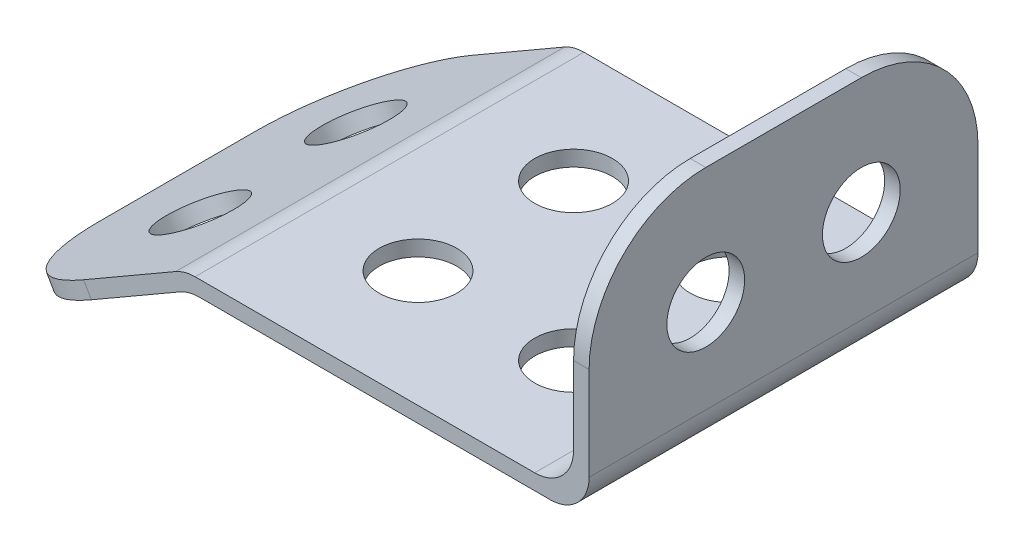
ISO-10303-21;
HEADER;
FILE_DESCRIPTION(('STEP AP214'),'2;1');
FILE_NAME('part.step','',(''),(''),'','','');
FILE_SCHEMA(('AUTOMOTIVE_DESIGN { 1 0 10303 214 1 1 1 1 }'));
ENDSEC;
DATA;
#1=APPLICATION_CONTEXT('core data for automotive mechanical design processes');
#2=APPLICATION_PROTOCOL_DEFINITION('international standard','automotive_design',2000,#1);
#3=PRODUCT_CONTEXT('',#1,'mechanical');
#4=PRODUCT('Part','Part','',(#3));
#5=PRODUCT_RELATED_PRODUCT_CATEGORY('part','',(#4));
#6=PRODUCT_DEFINITION_FORMATION('','',#4);
#7=PRODUCT_DEFINITION_CONTEXT('part definition',#1,'design');
#8=PRODUCT_DEFINITION('design','',#6,#7);
#9=PRODUCT_DEFINITION_SHAPE('','',#8);
#10=(LENGTH_UNIT() NAMED_UNIT(*) SI_UNIT(.MILLI.,.METRE.));
#11=(NAMED_UNIT(*) PLANE_ANGLE_UNIT() SI_UNIT($,.RADIAN.));
#12=(NAMED_UNIT(*) SI_UNIT($,.STERADIAN.) SOLID_ANGLE_UNIT());
#13=UNCERTAINTY_MEASURE_WITH_UNIT(LENGTH_MEASURE(1.E-05),#10,'distance_accuracy_value','');
#14=(GEOMETRIC_REPRESENTATION_CONTEXT(3) GLOBAL_UNCERTAINTY_ASSIGNED_CONTEXT((#13)) GLOBAL_UNIT_ASSIGNED_CONTEXT((#10,
#11,#12)) REPRESENTATION_CONTEXT('',''));
#15=CARTESIAN_POINT('',(0.,0.,0.));
#16=DIRECTION('',(0.,0.,1.));
#17=DIRECTION('',(1.,0.,0.));
#18=AXIS2_PLACEMENT_3D('',#15,#16,#17);
#19=CARTESIAN_POINT('',(10.,-16.7330508075689,35.));
#20=DIRECTION('',(0.,1.,0.));
#21=DIRECTION('',(-1.,0.,0.));
#22=AXIS2_PLACEMENT_3D('',#19,#20,#21);
#23=CYLINDRICAL_SURFACE('',#22,5.);
#24=CARTESIAN_POINT('',(9.99999999999999,0.,35.));
#25=DIRECTION('',(0.,1.,0.));
#26=DIRECTION('',(-1.,0.,0.));
#27=AXIS2_PLACEMENT_3D('',#24,#25,#26);
#28=CIRCLE('',#27,5.);
#29=CARTESIAN_POINT('',(4.99999999999999,0.,35.));
#30=VERTEX_POINT('',#29);
#31=EDGE_CURVE('E244',#30,#30,#28,.T.);
#32=ORIENTED_EDGE('',*,*,#31,.T.);
#33=EDGE_LOOP('',(#32));
#34=FACE_BOUND('',#33,.T.);
#35=CARTESIAN_POINT('',(9.99999999999999,-2.,35.));
#36=DIRECTION('',(0.,1.,0.));
#37=DIRECTION('',(-1.,0.,0.));
#38=AXIS2_PLACEMENT_3D('',#35,#36,#37);
#39=CIRCLE('',#38,5.);
#40=CARTESIAN_POINT('',(4.99999999999999,-2.,35.));
#41=VERTEX_POINT('',#40);
#42=EDGE_CURVE('E248',#41,#41,#39,.F.);
#43=ORIENTED_EDGE('',*,*,#42,.T.);
#44=EDGE_LOOP('',(#43));
#45=FACE_BOUND('',#44,.T.);
#46=ADVANCED_FACE('F41',(#34,#45),#23,.F.);
#47=CARTESIAN_POINT('',(10.,-16.7330508075689,15.));
#48=DIRECTION('',(0.,1.,0.));
#49=DIRECTION('',(-1.,0.,0.));
#50=AXIS2_PLACEMENT_3D('',#47,#48,#49);
#51=CYLINDRICAL_SURFACE('',#50,5.);
#52=CARTESIAN_POINT('',(9.99999999999999,0.,15.));
#53=DIRECTION('',(0.,1.,0.));
#54=DIRECTION('',(-1.,0.,0.));
#55=AXIS2_PLACEMENT_3D('',#52,#53,#54);
#56=CIRCLE('',#55,5.);
#57=CARTESIAN_POINT('',(4.99999999999999,0.,15.));
#58=VERTEX_POINT('',#57);
#59=EDGE_CURVE('E236',#58,#58,#56,.T.);
#60=ORIENTED_EDGE('',*,*,#59,.T.);
#61=EDGE_LOOP('',(#60));
#62=FACE_BOUND('',#61,.T.);
#63=CARTESIAN_POINT('',(9.99999999999999,-2.,15.));
#64=DIRECTION('',(0.,1.,0.));
#65=DIRECTION('',(-1.,0.,0.));
#66=AXIS2_PLACEMENT_3D('',#63,#64,#65);
#67=CIRCLE('',#66,5.);
#68=CARTESIAN_POINT('',(4.99999999999999,-2.,15.));
#69=VERTEX_POINT('',#68);
#70=EDGE_CURVE('E240',#69,#69,#67,.F.);
#71=ORIENTED_EDGE('',*,*,#70,.T.);
#72=EDGE_LOOP('',(#71));
#73=FACE_BOUND('',#72,.T.);
#74=ADVANCED_FACE('F442',(#62,#73),#51,.F.);
#75=CARTESIAN_POINT('',(27.,0.,50.));
#76=DIRECTION('',(-1.,0.,0.));
#77=DIRECTION('',(0.,0.,1.));
#78=AXIS2_PLACEMENT_3D('',#75,#76,#77);
#79=PLANE('',#78);
#80=CARTESIAN_POINT('',(27.,15.,35.));
#81=DIRECTION('',(-1.,0.,0.));
#82=DIRECTION('',(0.,0.,1.));
#83=AXIS2_PLACEMENT_3D('',#80,#81,#82);
#84=CIRCLE('',#83,5.);
#85=CARTESIAN_POINT('',(27.,15.,40.));
#86=VERTEX_POINT('',#85);
#87=EDGE_CURVE('E403',#86,#86,#84,.T.);
#88=ORIENTED_EDGE('',*,*,#87,.T.);
#89=EDGE_LOOP('',(#88));
#90=FACE_BOUND('',#89,.T.);
#91=CARTESIAN_POINT('',(27.,15.,15.));
#92=DIRECTION('',(-1.,0.,0.));
#93=DIRECTION('',(0.,0.,1.));
#94=AXIS2_PLACEMENT_3D('',#91,#92,#93);
#95=CIRCLE('',#94,5.);
#96=CARTESIAN_POINT('',(27.,15.,20.));
#97=VERTEX_POINT('',#96);
#98=EDGE_CURVE('E392',#97,#97,#95,.T.);
#99=ORIENTED_EDGE('',*,*,#98,.T.);
#100=EDGE_LOOP('',(#99));
#101=FACE_BOUND('',#100,.T.);
#102=DIRECTION('',(0.,1.,0.));
#103=VECTOR('',#102,1.);
#104=CARTESIAN_POINT('',(27.,0.,50.));
#105=LINE('',#104,#103);
#106=CARTESIAN_POINT('',(27.,3.00000000000001,50.));
#107=VERTEX_POINT('',#106);
#108=CARTESIAN_POINT('',(27.,15.,50.));
#109=VERTEX_POINT('',#108);
#110=EDGE_CURVE('E323',#107,#109,#105,.T.);
#111=ORIENTED_EDGE('',*,*,#110,.F.);
#112=DIRECTION('',(0.,0.,-1.));
#113=VECTOR('',#112,1.);
#114=CARTESIAN_POINT('',(27.,3.00000000000001,50.));
#115=LINE('',#114,#113);
#116=CARTESIAN_POINT('',(27.,3.00000000000001,0.));
#117=VERTEX_POINT('',#116);
#118=EDGE_CURVE('E166',#107,#117,#115,.T.);
#119=ORIENTED_EDGE('',*,*,#118,.T.);
#120=DIRECTION('',(0.,1.,0.));
#121=VECTOR('',#120,1.);
#122=CARTESIAN_POINT('',(27.,0.,0.));
#123=LINE('',#122,#121);
#124=CARTESIAN_POINT('',(27.,15.,0.));
#125=VERTEX_POINT('',#124);
#126=EDGE_CURVE('E158',#117,#125,#123,.T.);
#127=ORIENTED_EDGE('',*,*,#126,.T.);
#128=CARTESIAN_POINT('',(27.,15.,15.));
#129=DIRECTION('',(-1.,0.,0.));
#130=DIRECTION('',(0.,0.,1.));
#131=AXIS2_PLACEMENT_3D('',#128,#129,#130);
#132=CIRCLE('',#131,15.);
#133=CARTESIAN_POINT('',(27.,30.,15.));
#134=VERTEX_POINT('',#133);
#135=EDGE_CURVE('E163',#125,#134,#132,.F.);
#136=ORIENTED_EDGE('',*,*,#135,.T.);
#137=DIRECTION('',(0.,0.,-1.));
#138=VECTOR('',#137,1.);
#139=CARTESIAN_POINT('',(27.,30.,50.));
#140=LINE('',#139,#138);
#141=CARTESIAN_POINT('',(27.,30.,35.));
#142=VERTEX_POINT('',#141);
#143=EDGE_CURVE('E195',#142,#134,#140,.T.);
#144=ORIENTED_EDGE('',*,*,#143,.F.);
#145=CARTESIAN_POINT('',(27.,15.,35.));
#146=DIRECTION('',(-1.,0.,0.));
#147=DIRECTION('',(0.,0.,1.));
#148=AXIS2_PLACEMENT_3D('',#145,#146,#147);
#149=CIRCLE('',#148,15.);
#150=EDGE_CURVE('E182',#142,#109,#149,.F.);
#151=ORIENTED_EDGE('',*,*,#150,.T.);
#152=EDGE_LOOP('',(#111,#119,#127,#136,#144,#151));
#153=FACE_BOUND('',#152,.T.);
#154=ADVANCED_FACE('F161',(#90,#101,#153),#79,.F.);
#155=CARTESIAN_POINT('',(25.,30.,50.));
#156=DIRECTION('',(0.,1.,0.));
#157=DIRECTION('',(0.,0.,1.));
#158=AXIS2_PLACEMENT_3D('',#155,#156,#157);
#159=PLANE('',#158);
#160=ORIENTED_EDGE('',*,*,#143,.T.);
#161=DIRECTION('',(1.,0.,0.));
#162=VECTOR('',#161,1.);
#163=CARTESIAN_POINT('',(25.,30.,15.));
#164=LINE('',#163,#162);
#165=CARTESIAN_POINT('',(25.,30.,15.));
#166=VERTEX_POINT('',#165);
#167=EDGE_CURVE('E179',#134,#166,#164,.F.);
#168=ORIENTED_EDGE('',*,*,#167,.T.);
#169=DIRECTION('',(0.,0.,-1.));
#170=VECTOR('',#169,1.);
#171=CARTESIAN_POINT('',(25.,30.,50.));
#172=LINE('',#171,#170);
#173=CARTESIAN_POINT('',(25.,30.,35.));
#174=VERTEX_POINT('',#173);
#175=EDGE_CURVE('E353',#174,#166,#172,.T.);
#176=ORIENTED_EDGE('',*,*,#175,.F.);
#177=DIRECTION('',(1.,0.,0.));
#178=VECTOR('',#177,1.);
#179=CARTESIAN_POINT('',(27.,30.,35.));
#180=LINE('',#179,#178);
#181=EDGE_CURVE('E181',#174,#142,#180,.T.);
#182=ORIENTED_EDGE('',*,*,#181,.T.);
#183=EDGE_LOOP('',(#160,#168,#176,#182));
#184=FACE_BOUND('',#183,.T.);
#185=ADVANCED_FACE('F357',(#184),#159,.T.);
#186=CARTESIAN_POINT('',(25.,0.,50.));
#187=DIRECTION('',(-1.,0.,0.));
#188=DIRECTION('',(0.,0.,1.));
#189=AXIS2_PLACEMENT_3D('',#186,#187,#188);
#190=PLANE('',#189);
#191=CARTESIAN_POINT('',(25.,15.,35.));
#192=DIRECTION('',(-1.,0.,0.));
#193=DIRECTION('',(0.,0.,1.));
#194=AXIS2_PLACEMENT_3D('',#191,#192,#193);
#195=CIRCLE('',#194,5.);
#196=CARTESIAN_POINT('',(25.,15.,40.));
#197=VERTEX_POINT('',#196);
#198=EDGE_CURVE('E407',#197,#197,#195,.T.);
#199=ORIENTED_EDGE('',*,*,#198,.F.);
#200=EDGE_LOOP('',(#199));
#201=FACE_BOUND('',#200,.T.);
#202=CARTESIAN_POINT('',(25.,15.,15.));
#203=DIRECTION('',(-1.,0.,0.));
#204=DIRECTION('',(0.,0.,1.));
#205=AXIS2_PLACEMENT_3D('',#202,#203,#204);
#206=CIRCLE('',#205,5.);
#207=CARTESIAN_POINT('',(25.,15.,20.));
#208=VERTEX_POINT('',#207);
#209=EDGE_CURVE('E399',#208,#208,#206,.T.);
#210=ORIENTED_EDGE('',*,*,#209,.F.);
#211=EDGE_LOOP('',(#210));
#212=FACE_BOUND('',#211,.T.);
#213=DIRECTION('',(0.,1.,0.));
#214=VECTOR('',#213,1.);
#215=CARTESIAN_POINT('',(25.,0.,0.));
#216=LINE('',#215,#214);
#217=CARTESIAN_POINT('',(25.,5.00000000000001,0.));
#218=VERTEX_POINT('',#217);
#219=CARTESIAN_POINT('',(25.,15.,0.));
#220=VERTEX_POINT('',#219);
#221=EDGE_CURVE('E170',#218,#220,#216,.T.);
#222=ORIENTED_EDGE('',*,*,#221,.F.);
#223=DIRECTION('',(0.,0.,-1.));
#224=VECTOR('',#223,1.);
#225=CARTESIAN_POINT('',(25.,5.00000000000001,50.));
#226=LINE('',#225,#224);
#227=CARTESIAN_POINT('',(25.,5.00000000000001,50.));
#228=VERTEX_POINT('',#227);
#229=EDGE_CURVE('E285',#218,#228,#226,.F.);
#230=ORIENTED_EDGE('',*,*,#229,.T.);
#231=DIRECTION('',(0.,1.,0.));
#232=VECTOR('',#231,1.);
#233=CARTESIAN_POINT('',(25.,0.,50.));
#234=LINE('',#233,#232);
#235=CARTESIAN_POINT('',(25.,15.,50.));
#236=VERTEX_POINT('',#235);
#237=EDGE_CURVE('E311',#228,#236,#234,.T.);
#238=ORIENTED_EDGE('',*,*,#237,.T.);
#239=CARTESIAN_POINT('',(25.,15.,35.));
#240=DIRECTION('',(-1.,0.,0.));
#241=DIRECTION('',(0.,0.,1.));
#242=AXIS2_PLACEMENT_3D('',#239,#240,#241);
#243=CIRCLE('',#242,15.);
#244=EDGE_CURVE('E204',#236,#174,#243,.T.);
#245=ORIENTED_EDGE('',*,*,#244,.T.);
#246=ORIENTED_EDGE('',*,*,#175,.T.);
#247=CARTESIAN_POINT('',(25.,15.,15.));
#248=DIRECTION('',(-1.,0.,0.));
#249=DIRECTION('',(0.,0.,1.));
#250=AXIS2_PLACEMENT_3D('',#247,#248,#249);
#251=CIRCLE('',#250,15.);
#252=EDGE_CURVE('E207',#166,#220,#251,.T.);
#253=ORIENTED_EDGE('',*,*,#252,.T.);
#254=EDGE_LOOP('',(#222,#230,#238,#245,#246,#253));
#255=FACE_BOUND('',#254,.T.);
#256=ADVANCED_FACE('F301',(#201,#212,#255),#190,.T.);
#257=CARTESIAN_POINT('',(25.,0.,50.));
#258=DIRECTION('',(0.,1.,0.));
#259=DIRECTION('',(-1.,0.,0.));
#260=AXIS2_PLACEMENT_3D('',#257,#258,#259);
#261=PLANE('',#260);
#262=CARTESIAN_POINT('',(-10.,0.,35.));
#263=DIRECTION('',(0.,1.,0.));
#264=DIRECTION('',(-1.,0.,0.));
#265=AXIS2_PLACEMENT_3D('',#262,#263,#264);
#266=CIRCLE('',#265,5.);
#267=CARTESIAN_POINT('',(-15.,0.,35.));
#268=VERTEX_POINT('',#267);
#269=EDGE_CURVE('E378',#268,#268,#266,.T.);
#270=ORIENTED_EDGE('',*,*,#269,.F.);
#271=EDGE_LOOP('',(#270));
#272=FACE_BOUND('',#271,.T.);
#273=CARTESIAN_POINT('',(-10.,0.,15.));
#274=DIRECTION('',(0.,1.,0.));
#275=DIRECTION('',(-1.,0.,0.));
#276=AXIS2_PLACEMENT_3D('',#273,#274,#275);
#277=CIRCLE('',#276,5.);
#278=CARTESIAN_POINT('',(-15.,0.,15.));
#279=VERTEX_POINT('',#278);
#280=EDGE_CURVE('E370',#279,#279,#277,.T.);
#281=ORIENTED_EDGE('',*,*,#280,.F.);
#282=EDGE_LOOP('',(#281));
#283=FACE_BOUND('',#282,.T.);
#284=DIRECTION('',(1.,0.,0.));
#285=VECTOR('',#284,1.);
#286=CARTESIAN_POINT('',(25.,0.,0.));
#287=LINE('',#286,#285);
#288=CARTESIAN_POINT('',(-23.6602540378444,0.,0.));
#289=VERTEX_POINT('',#288);
#290=CARTESIAN_POINT('',(20.,0.,0.));
#291=VERTEX_POINT('',#290);
#292=EDGE_CURVE('E296',#289,#291,#287,.T.);
#293=ORIENTED_EDGE('',*,*,#292,.F.);
#294=DIRECTION('',(0.,0.,-1.));
#295=VECTOR('',#294,1.);
#296=CARTESIAN_POINT('',(-23.6602540378444,0.,50.));
#297=LINE('',#296,#295);
#298=CARTESIAN_POINT('',(-23.6602540378444,0.,50.));
#299=VERTEX_POINT('',#298);
#300=EDGE_CURVE('E282',#289,#299,#297,.F.);
#301=ORIENTED_EDGE('',*,*,#300,.T.);
#302=DIRECTION('',(1.,0.,0.));
#303=VECTOR('',#302,1.);
#304=CARTESIAN_POINT('',(25.,0.,50.));
#305=LINE('',#304,#303);
#306=CARTESIAN_POINT('',(20.,0.,50.));
#307=VERTEX_POINT('',#306);
#308=EDGE_CURVE('E310',#299,#307,#305,.T.);
#309=ORIENTED_EDGE('',*,*,#308,.T.);
#310=DIRECTION('',(0.,0.,-1.));
#311=VECTOR('',#310,1.);
#312=CARTESIAN_POINT('',(20.,0.,0.));
#313=LINE('',#312,#311);
#314=EDGE_CURVE('E278',#307,#291,#313,.T.);
#315=ORIENTED_EDGE('',*,*,#314,.T.);
#316=EDGE_LOOP('',(#293,#301,#309,#315));
#317=FACE_BOUND('',#316,.T.);
#318=ORIENTED_EDGE('',*,*,#59,.F.);
#319=EDGE_LOOP('',(#318));
#320=FACE_BOUND('',#319,.T.);
#321=ORIENTED_EDGE('',*,*,#31,.F.);
#322=EDGE_LOOP('',(#321));
#323=FACE_BOUND('',#322,.T.);
#324=ADVANCED_FACE('F313',(#272,#283,#317,#320,#323),#261,.T.);
#325=CARTESIAN_POINT('',(-25.,0.,50.));
#326=DIRECTION('',(-0.500000000000001,0.866025403784438,0.));
#327=DIRECTION('',(-0.866025403784438,-0.500000000000001,0.));
#328=AXIS2_PLACEMENT_3D('',#325,#326,#327);
#329=PLANE('',#328);
#330=CARTESIAN_POINT('',(-37.9903810567666,-7.50000000000003,15.));
#331=DIRECTION('',(-0.500000000000001,0.866025403784438,0.));
#332=DIRECTION('',(-0.866025403784438,-0.500000000000001,0.));
#333=AXIS2_PLACEMENT_3D('',#330,#331,#332);
#334=CIRCLE('',#333,4.99999999999999);
#335=CARTESIAN_POINT('',(-42.3205080756888,-10.,15.));
#336=VERTEX_POINT('',#335);
#337=EDGE_CURVE('E387',#336,#336,#334,.T.);
#338=ORIENTED_EDGE('',*,*,#337,.F.);
#339=EDGE_LOOP('',(#338));
#340=FACE_BOUND('',#339,.T.);
#341=CARTESIAN_POINT('',(-37.9903810567666,-7.50000000000003,35.));
#342=DIRECTION('',(-0.500000000000001,0.866025403784438,0.));
#343=DIRECTION('',(-0.866025403784438,-0.500000000000001,0.));
#344=AXIS2_PLACEMENT_3D('',#341,#342,#343);
#345=CIRCLE('',#344,4.99999999999999);
#346=CARTESIAN_POINT('',(-42.3205080756888,-10.,35.));
#347=VERTEX_POINT('',#346);
#348=EDGE_CURVE('E388',#347,#347,#345,.T.);
#349=ORIENTED_EDGE('',*,*,#348,.F.);
#350=EDGE_LOOP('',(#349));
#351=FACE_BOUND('',#350,.T.);
#352=DIRECTION('',(0.866025403784438,0.500000000000001,0.));
#353=VECTOR('',#352,1.);
#354=CARTESIAN_POINT('',(-25.,0.,50.));
#355=LINE('',#354,#353);
#356=CARTESIAN_POINT('',(-37.9903810567666,-7.50000000000002,50.));
#357=VERTEX_POINT('',#356);
#358=CARTESIAN_POINT('',(-26.1602540378444,-0.669872981077816,50.));
#359=VERTEX_POINT('',#358);
#360=EDGE_CURVE('E317',#357,#359,#355,.T.);
#361=ORIENTED_EDGE('',*,*,#360,.T.);
#362=DIRECTION('',(0.,0.,-1.));
#363=VECTOR('',#362,1.);
#364=CARTESIAN_POINT('',(-26.1602540378444,-0.669872981077815,50.));
#365=LINE('',#364,#363);
#366=CARTESIAN_POINT('',(-26.1602540378444,-0.669872981077816,0.));
#367=VERTEX_POINT('',#366);
#368=EDGE_CURVE('E274',#359,#367,#365,.T.);
#369=ORIENTED_EDGE('',*,*,#368,.T.);
#370=DIRECTION('',(0.866025403784438,0.500000000000001,0.));
#371=VECTOR('',#370,1.);
#372=CARTESIAN_POINT('',(-25.,0.,0.));
#373=LINE('',#372,#371);
#374=CARTESIAN_POINT('',(-37.9903810567666,-7.50000000000002,0.));
#375=VERTEX_POINT('',#374);
#376=EDGE_CURVE('E335',#375,#367,#373,.T.);
#377=ORIENTED_EDGE('',*,*,#376,.F.);
#378=CARTESIAN_POINT('',(-37.9903810567666,-7.50000000000002,15.));
#379=DIRECTION('',(-0.500000000000001,0.866025403784438,0.));
#380=DIRECTION('',(-0.866025403784438,-0.500000000000001,0.));
#381=AXIS2_PLACEMENT_3D('',#378,#379,#380);
#382=CIRCLE('',#381,15.);
#383=CARTESIAN_POINT('',(-50.9807621135331,-15.,15.));
#384=VERTEX_POINT('',#383);
#385=EDGE_CURVE('E220',#375,#384,#382,.T.);
#386=ORIENTED_EDGE('',*,*,#385,.T.);
#387=DIRECTION('',(0.,0.,-1.));
#388=VECTOR('',#387,1.);
#389=CARTESIAN_POINT('',(-50.9807621135331,-15.,50.));
#390=LINE('',#389,#388);
#391=CARTESIAN_POINT('',(-50.9807621135331,-15.,35.));
#392=VERTEX_POINT('',#391);
#393=EDGE_CURVE('E349',#392,#384,#390,.T.);
#394=ORIENTED_EDGE('',*,*,#393,.F.);
#395=CARTESIAN_POINT('',(-37.9903810567666,-7.50000000000002,35.));
#396=DIRECTION('',(-0.500000000000001,0.866025403784438,0.));
#397=DIRECTION('',(-0.866025403784438,-0.500000000000001,0.));
#398=AXIS2_PLACEMENT_3D('',#395,#396,#397);
#399=CIRCLE('',#398,15.);
#400=EDGE_CURVE('E217',#392,#357,#399,.T.);
#401=ORIENTED_EDGE('',*,*,#400,.T.);
#402=EDGE_LOOP('',(#361,#369,#377,#386,#394,#401));
#403=FACE_BOUND('',#402,.T.);
#404=ADVANCED_FACE('F468',(#340,#351,#403),#329,.T.);
#405=CARTESIAN_POINT('',(-49.9807621135331,-16.7320508075689,50.));
#406=DIRECTION('',(-0.86602540378444,-0.499999999999997,0.));
#407=DIRECTION('',(0.499999999999997,-0.86602540378444,0.));
#408=AXIS2_PLACEMENT_3D('',#405,#406,#407);
#409=PLANE('',#408);
#410=ORIENTED_EDGE('',*,*,#393,.T.);
#411=DIRECTION('',(-0.499999999999997,0.86602540378444,0.));
#412=VECTOR('',#411,1.);
#413=CARTESIAN_POINT('',(-49.9807621135331,-16.7320508075689,15.));
#414=LINE('',#413,#412);
#415=CARTESIAN_POINT('',(-49.9807621135331,-16.7320508075689,15.));
#416=VERTEX_POINT('',#415);
#417=EDGE_CURVE('E227',#384,#416,#414,.F.);
#418=ORIENTED_EDGE('',*,*,#417,.T.);
#419=DIRECTION('',(0.,0.,-1.));
#420=VECTOR('',#419,1.);
#421=CARTESIAN_POINT('',(-49.9807621135331,-16.7320508075689,50.));
#422=LINE('',#421,#420);
#423=CARTESIAN_POINT('',(-49.9807621135331,-16.7320508075689,35.));
#424=VERTEX_POINT('',#423);
#425=EDGE_CURVE('E331',#424,#416,#422,.T.);
#426=ORIENTED_EDGE('',*,*,#425,.F.);
#427=DIRECTION('',(-0.499999999999997,0.86602540378444,0.));
#428=VECTOR('',#427,1.);
#429=CARTESIAN_POINT('',(-50.9807621135331,-15.,35.));
#430=LINE('',#429,#428);
#431=EDGE_CURVE('E223',#424,#392,#430,.T.);
#432=ORIENTED_EDGE('',*,*,#431,.T.);
#433=EDGE_LOOP('',(#410,#418,#426,#432));
#434=FACE_BOUND('',#433,.T.);
#435=ADVANCED_FACE('F477',(#434),#409,.T.);
#436=CARTESIAN_POINT('',(-24.,-1.73205080756888,50.));
#437=DIRECTION('',(-0.500000000000001,0.866025403784438,0.));
#438=DIRECTION('',(-0.866025403784438,-0.500000000000001,0.));
#439=AXIS2_PLACEMENT_3D('',#436,#437,#438);
#440=PLANE('',#439);
#441=CARTESIAN_POINT('',(-36.9903810567666,-9.2320508075689,15.));
#442=DIRECTION('',(-0.500000000000001,0.866025403784438,0.));
#443=DIRECTION('',(-0.866025403784438,-0.500000000000001,0.));
#444=AXIS2_PLACEMENT_3D('',#441,#442,#443);
#445=CIRCLE('',#444,4.99999999999999);
#446=CARTESIAN_POINT('',(-41.3205080756887,-11.7320508075689,15.));
#447=VERTEX_POINT('',#446);
#448=EDGE_CURVE('E382',#447,#447,#445,.F.);
#449=ORIENTED_EDGE('',*,*,#448,.F.);
#450=EDGE_LOOP('',(#449));
#451=FACE_BOUND('',#450,.T.);
#452=CARTESIAN_POINT('',(-36.9903810567666,-9.2320508075689,35.));
#453=DIRECTION('',(-0.500000000000001,0.866025403784438,0.));
#454=DIRECTION('',(-0.866025403784438,-0.500000000000001,0.));
#455=AXIS2_PLACEMENT_3D('',#452,#453,#454);
#456=CIRCLE('',#455,4.99999999999999);
#457=CARTESIAN_POINT('',(-41.3205080756887,-11.7320508075689,35.));
#458=VERTEX_POINT('',#457);
#459=EDGE_CURVE('E383',#458,#458,#456,.F.);
#460=ORIENTED_EDGE('',*,*,#459,.F.);
#461=EDGE_LOOP('',(#460));
#462=FACE_BOUND('',#461,.T.);
#463=DIRECTION('',(0.866025403784438,0.500000000000001,0.));
#464=VECTOR('',#463,1.);
#465=CARTESIAN_POINT('',(-24.,-1.73205080756888,0.));
#466=LINE('',#465,#464);
#467=CARTESIAN_POINT('',(-36.9903810567666,-9.23205080756891,0.));
#468=VERTEX_POINT('',#467);
#469=CARTESIAN_POINT('',(-25.6243556529821,-2.66987298107782,0.));
#470=VERTEX_POINT('',#469);
#471=EDGE_CURVE('E339',#468,#470,#466,.T.);
#472=ORIENTED_EDGE('',*,*,#471,.T.);
#473=DIRECTION('',(0.,0.,-1.));
#474=VECTOR('',#473,1.);
#475=CARTESIAN_POINT('',(-25.6243556529821,-2.66987298107782,50.));
#476=LINE('',#475,#474);
#477=CARTESIAN_POINT('',(-25.6243556529821,-2.66987298107782,50.));
#478=VERTEX_POINT('',#477);
#479=EDGE_CURVE('E57',#470,#478,#476,.F.);
#480=ORIENTED_EDGE('',*,*,#479,.T.);
#481=DIRECTION('',(0.866025403784438,0.500000000000001,0.));
#482=VECTOR('',#481,1.);
#483=CARTESIAN_POINT('',(-24.,-1.73205080756888,50.));
#484=LINE('',#483,#482);
#485=CARTESIAN_POINT('',(-36.9903810567666,-9.23205080756891,50.));
#486=VERTEX_POINT('',#485);
#487=EDGE_CURVE('E321',#486,#478,#484,.T.);
#488=ORIENTED_EDGE('',*,*,#487,.F.);
#489=CARTESIAN_POINT('',(-36.9903810567666,-9.23205080756891,35.));
#490=DIRECTION('',(-0.500000000000001,0.866025403784438,0.));
#491=DIRECTION('',(-0.866025403784438,-0.500000000000001,0.));
#492=AXIS2_PLACEMENT_3D('',#489,#490,#491);
#493=CIRCLE('',#492,15.);
#494=EDGE_CURVE('E230',#486,#424,#493,.F.);
#495=ORIENTED_EDGE('',*,*,#494,.T.);
#496=ORIENTED_EDGE('',*,*,#425,.T.);
#497=CARTESIAN_POINT('',(-36.9903810567666,-9.2320508075689,15.));
#498=DIRECTION('',(-0.500000000000001,0.866025403784438,0.));
#499=DIRECTION('',(-0.866025403784438,-0.500000000000001,0.));
#500=AXIS2_PLACEMENT_3D('',#497,#498,#499);
#501=CIRCLE('',#500,15.);
#502=EDGE_CURVE('E233',#416,#468,#501,.F.);
#503=ORIENTED_EDGE('',*,*,#502,.T.);
#504=EDGE_LOOP('',(#472,#480,#488,#495,#496,#503));
#505=FACE_BOUND('',#504,.T.);
#506=ADVANCED_FACE('F485',(#451,#462,#505),#440,.F.);
#507=CARTESIAN_POINT('',(25.,-1.99999999999999,50.));
#508=DIRECTION('',(0.,1.,0.));
#509=DIRECTION('',(-1.,0.,0.));
#510=AXIS2_PLACEMENT_3D('',#507,#508,#509);
#511=PLANE('',#510);
#512=CARTESIAN_POINT('',(-10.,-2.,35.));
#513=DIRECTION('',(0.,1.,0.));
#514=DIRECTION('',(-1.,0.,0.));
#515=AXIS2_PLACEMENT_3D('',#512,#513,#514);
#516=CIRCLE('',#515,5.);
#517=CARTESIAN_POINT('',(-15.,-2.,35.));
#518=VERTEX_POINT('',#517);
#519=EDGE_CURVE('E374',#518,#518,#516,.F.);
#520=ORIENTED_EDGE('',*,*,#519,.F.);
#521=EDGE_LOOP('',(#520));
#522=FACE_BOUND('',#521,.T.);
#523=CARTESIAN_POINT('',(-10.,-2.,15.));
#524=DIRECTION('',(0.,1.,0.));
#525=DIRECTION('',(-1.,0.,0.));
#526=AXIS2_PLACEMENT_3D('',#523,#524,#525);
#527=CIRCLE('',#526,5.);
#528=CARTESIAN_POINT('',(-15.,-2.,15.));
#529=VERTEX_POINT('',#528);
#530=EDGE_CURVE('E171',#529,#529,#527,.F.);
#531=ORIENTED_EDGE('',*,*,#530,.F.);
#532=EDGE_LOOP('',(#531));
#533=FACE_BOUND('',#532,.T.);
#534=DIRECTION('',(1.,0.,0.));
#535=VECTOR('',#534,1.);
#536=CARTESIAN_POINT('',(25.,-1.99999999999999,0.));
#537=LINE('',#536,#535);
#538=CARTESIAN_POINT('',(-23.1243556529821,-2.00000000000001,0.));
#539=VERTEX_POINT('',#538);
#540=CARTESIAN_POINT('',(22.,-1.99999999999999,0.));
#541=VERTEX_POINT('',#540);
#542=EDGE_CURVE('E342',#539,#541,#537,.T.);
#543=ORIENTED_EDGE('',*,*,#542,.T.);
#544=DIRECTION('',(0.,0.,-1.));
#545=VECTOR('',#544,1.);
#546=CARTESIAN_POINT('',(22.,-1.99999999999999,50.));
#547=LINE('',#546,#545);
#548=CARTESIAN_POINT('',(22.,-1.99999999999999,50.));
#549=VERTEX_POINT('',#548);
#550=EDGE_CURVE('E264',#541,#549,#547,.F.);
#551=ORIENTED_EDGE('',*,*,#550,.T.);
#552=DIRECTION('',(1.,0.,0.));
#553=VECTOR('',#552,1.);
#554=CARTESIAN_POINT('',(25.,-1.99999999999999,50.));
#555=LINE('',#554,#553);
#556=CARTESIAN_POINT('',(-23.1243556529821,-2.00000000000001,50.));
#557=VERTEX_POINT('',#556);
#558=EDGE_CURVE('E329',#557,#549,#555,.T.);
#559=ORIENTED_EDGE('',*,*,#558,.F.);
#560=DIRECTION('',(0.,0.,-1.));
#561=VECTOR('',#560,1.);
#562=CARTESIAN_POINT('',(-23.1243556529821,-2.00000000000001,0.));
#563=LINE('',#562,#561);
#564=EDGE_CURVE('E260',#557,#539,#563,.T.);
#565=ORIENTED_EDGE('',*,*,#564,.T.);
#566=EDGE_LOOP('',(#543,#551,#559,#565));
#567=FACE_BOUND('',#566,.T.);
#568=ORIENTED_EDGE('',*,*,#70,.F.);
#569=EDGE_LOOP('',(#568));
#570=FACE_BOUND('',#569,.T.);
#571=ORIENTED_EDGE('',*,*,#42,.F.);
#572=EDGE_LOOP('',(#571));
#573=FACE_BOUND('',#572,.T.);
#574=ADVANCED_FACE('F489',(#522,#533,#567,#570,#573),#511,.F.);
#575=CARTESIAN_POINT('',(0.,0.,50.));
#576=DIRECTION('',(0.,0.,-1.));
#577=DIRECTION('',(-1.,0.,0.));
#578=AXIS2_PLACEMENT_3D('',#575,#576,#577);
#579=PLANE('',#578);
#580=ORIENTED_EDGE('',*,*,#558,.T.);
#581=CARTESIAN_POINT('',(22.,3.00000000000001,50.));
#582=DIRECTION('',(0.,0.,-1.));
#583=DIRECTION('',(-1.,0.,0.));
#584=AXIS2_PLACEMENT_3D('',#581,#582,#583);
#585=CIRCLE('',#584,5.);
#586=EDGE_CURVE('E269',#549,#107,#585,.F.);
#587=ORIENTED_EDGE('',*,*,#586,.T.);
#588=ORIENTED_EDGE('',*,*,#110,.T.);
#589=DIRECTION('',(1.,0.,0.));
#590=VECTOR('',#589,1.);
#591=CARTESIAN_POINT('',(25.,15.,50.));
#592=LINE('',#591,#590);
#593=EDGE_CURVE('E213',#109,#236,#592,.F.);
#594=ORIENTED_EDGE('',*,*,#593,.T.);
#595=ORIENTED_EDGE('',*,*,#237,.F.);
#596=CARTESIAN_POINT('',(20.,5.00000000000001,50.));
#597=DIRECTION('',(0.,0.,-1.));
#598=DIRECTION('',(-1.,0.,0.));
#599=AXIS2_PLACEMENT_3D('',#596,#597,#598);
#600=CIRCLE('',#599,5.);
#601=EDGE_CURVE('E11',#228,#307,#600,.T.);
#602=ORIENTED_EDGE('',*,*,#601,.T.);
#603=ORIENTED_EDGE('',*,*,#308,.F.);
#604=CARTESIAN_POINT('',(-23.6602540378444,-5.00000000000001,50.));
#605=DIRECTION('',(0.,0.,-1.));
#606=DIRECTION('',(-1.,0.,0.));
#607=AXIS2_PLACEMENT_3D('',#604,#605,#606);
#608=CIRCLE('',#607,5.);
#609=EDGE_CURVE('E65',#299,#359,#608,.F.);
#610=ORIENTED_EDGE('',*,*,#609,.T.);
#611=ORIENTED_EDGE('',*,*,#360,.F.);
#612=DIRECTION('',(-0.499999999999997,0.86602540378444,0.));
#613=VECTOR('',#612,1.);
#614=CARTESIAN_POINT('',(-36.9903810567665,-9.23205080756897,50.));
#615=LINE('',#614,#613);
#616=EDGE_CURVE('E210',#357,#486,#615,.F.);
#617=ORIENTED_EDGE('',*,*,#616,.T.);
#618=ORIENTED_EDGE('',*,*,#487,.T.);
#619=CARTESIAN_POINT('',(-23.1243556529821,-7.00000000000001,50.));
#620=DIRECTION('',(0.,0.,-1.));
#621=DIRECTION('',(-1.,0.,0.));
#622=AXIS2_PLACEMENT_3D('',#619,#620,#621);
#623=CIRCLE('',#622,5.);
#624=EDGE_CURVE('E291',#478,#557,#623,.T.);
#625=ORIENTED_EDGE('',*,*,#624,.T.);
#626=EDGE_LOOP('',(#580,#587,#588,#594,#595,#602,#603,#610,#611,#617,#618,#625));
#627=FACE_BOUND('',#626,.T.);
#628=ADVANCED_FACE('F309',(#627),#579,.F.);
#629=CARTESIAN_POINT('',(0.,0.,0.));
#630=DIRECTION('',(0.,0.,-1.));
#631=DIRECTION('',(-1.,0.,0.));
#632=AXIS2_PLACEMENT_3D('',#629,#630,#631);
#633=PLANE('',#632);
#634=ORIENTED_EDGE('',*,*,#126,.F.);
#635=CARTESIAN_POINT('',(22.,3.00000000000001,0.));
#636=DIRECTION('',(0.,0.,-1.));
#637=DIRECTION('',(-1.,0.,0.));
#638=AXIS2_PLACEMENT_3D('',#635,#636,#637);
#639=CIRCLE('',#638,5.);
#640=EDGE_CURVE('E257',#117,#541,#639,.T.);
#641=ORIENTED_EDGE('',*,*,#640,.T.);
#642=ORIENTED_EDGE('',*,*,#542,.F.);
#643=CARTESIAN_POINT('',(-23.1243556529821,-7.00000000000001,0.));
#644=DIRECTION('',(0.,0.,-1.));
#645=DIRECTION('',(-1.,0.,0.));
#646=AXIS2_PLACEMENT_3D('',#643,#644,#645);
#647=CIRCLE('',#646,5.);
#648=EDGE_CURVE('E288',#539,#470,#647,.F.);
#649=ORIENTED_EDGE('',*,*,#648,.T.);
#650=ORIENTED_EDGE('',*,*,#471,.F.);
#651=DIRECTION('',(-0.499999999999997,0.86602540378444,0.));
#652=VECTOR('',#651,1.);
#653=CARTESIAN_POINT('',(-31.7403810567667,-18.3253175473054,0.));
#654=LINE('',#653,#652);
#655=EDGE_CURVE('E188',#468,#375,#654,.T.);
#656=ORIENTED_EDGE('',*,*,#655,.T.);
#657=ORIENTED_EDGE('',*,*,#376,.T.);
#658=CARTESIAN_POINT('',(-23.6602540378444,-5.00000000000001,0.));
#659=DIRECTION('',(0.,0.,-1.));
#660=DIRECTION('',(-1.,0.,0.));
#661=AXIS2_PLACEMENT_3D('',#658,#659,#660);
#662=CIRCLE('',#661,5.);
#663=EDGE_CURVE('E254',#367,#289,#662,.T.);
#664=ORIENTED_EDGE('',*,*,#663,.T.);
#665=ORIENTED_EDGE('',*,*,#292,.T.);
#666=CARTESIAN_POINT('',(20.,5.00000000000001,0.));
#667=DIRECTION('',(0.,0.,-1.));
#668=DIRECTION('',(-1.,0.,0.));
#669=AXIS2_PLACEMENT_3D('',#666,#667,#668);
#670=CIRCLE('',#669,5.);
#671=EDGE_CURVE('E50',#291,#218,#670,.F.);
#672=ORIENTED_EDGE('',*,*,#671,.T.);
#673=ORIENTED_EDGE('',*,*,#221,.T.);
#674=DIRECTION('',(1.,0.,0.));
#675=VECTOR('',#674,1.);
#676=CARTESIAN_POINT('',(0.,15.,0.));
#677=LINE('',#676,#675);
#678=EDGE_CURVE('E178',#220,#125,#677,.T.);
#679=ORIENTED_EDGE('',*,*,#678,.T.);
#680=EDGE_LOOP('',(#634,#641,#642,#649,#650,#656,#657,#664,#665,#672,#673,#679));
#681=FACE_BOUND('',#680,.T.);
#682=ADVANCED_FACE('F184',(#681),#633,.T.);
#683=CARTESIAN_POINT('',(0.,15.,15.));
#684=DIRECTION('',(1.,0.,0.));
#685=DIRECTION('',(0.,0.,-1.));
#686=AXIS2_PLACEMENT_3D('',#683,#684,#685);
#687=CYLINDRICAL_SURFACE('',#686,15.);
#688=ORIENTED_EDGE('',*,*,#252,.F.);
#689=ORIENTED_EDGE('',*,*,#167,.F.);
#690=ORIENTED_EDGE('',*,*,#135,.F.);
#691=ORIENTED_EDGE('',*,*,#678,.F.);
#692=EDGE_LOOP('',(#688,#689,#690,#691));
#693=FACE_BOUND('',#692,.T.);
#694=ADVANCED_FACE('F177',(#693),#687,.T.);
#695=CARTESIAN_POINT('',(25.,15.,35.));
#696=DIRECTION('',(-1.,0.,0.));
#697=DIRECTION('',(0.,0.,1.));
#698=AXIS2_PLACEMENT_3D('',#695,#696,#697);
#699=CYLINDRICAL_SURFACE('',#698,15.);
#700=ORIENTED_EDGE('',*,*,#244,.F.);
#701=ORIENTED_EDGE('',*,*,#593,.F.);
#702=ORIENTED_EDGE('',*,*,#150,.F.);
#703=ORIENTED_EDGE('',*,*,#181,.F.);
#704=EDGE_LOOP('',(#700,#701,#702,#703));
#705=FACE_BOUND('',#704,.T.);
#706=ADVANCED_FACE('F363',(#705),#699,.T.);
#707=CARTESIAN_POINT('',(-31.7403810567667,-18.3253175473054,15.));
#708=DIRECTION('',(-0.499999999999997,0.86602540378444,0.));
#709=DIRECTION('',(-0.86602540378444,-0.499999999999997,0.));
#710=AXIS2_PLACEMENT_3D('',#707,#708,#709);
#711=CYLINDRICAL_SURFACE('',#710,15.);
#712=ORIENTED_EDGE('',*,*,#502,.F.);
#713=ORIENTED_EDGE('',*,*,#417,.F.);
#714=ORIENTED_EDGE('',*,*,#385,.F.);
#715=ORIENTED_EDGE('',*,*,#655,.F.);
#716=EDGE_LOOP('',(#712,#713,#714,#715));
#717=FACE_BOUND('',#716,.T.);
#718=ADVANCED_FACE('F473',(#717),#711,.T.);
#719=CARTESIAN_POINT('',(-36.9903810567665,-9.23205080756897,35.));
#720=DIRECTION('',(0.499999999999997,-0.86602540378444,0.));
#721=DIRECTION('',(0.86602540378444,0.499999999999997,0.));
#722=AXIS2_PLACEMENT_3D('',#719,#720,#721);
#723=CYLINDRICAL_SURFACE('',#722,15.);
#724=ORIENTED_EDGE('',*,*,#494,.F.);
#725=ORIENTED_EDGE('',*,*,#616,.F.);
#726=ORIENTED_EDGE('',*,*,#400,.F.);
#727=ORIENTED_EDGE('',*,*,#431,.F.);
#728=EDGE_LOOP('',(#724,#725,#726,#727));
#729=FACE_BOUND('',#728,.T.);
#730=ADVANCED_FACE('F482',(#729),#723,.T.);
#731=CARTESIAN_POINT('',(-10.,-16.7330508075689,15.));
#732=DIRECTION('',(0.,1.,0.));
#733=DIRECTION('',(-1.,0.,0.));
#734=AXIS2_PLACEMENT_3D('',#731,#732,#733);
#735=CYLINDRICAL_SURFACE('',#734,5.);
#736=ORIENTED_EDGE('',*,*,#280,.T.);
#737=EDGE_LOOP('',(#736));
#738=FACE_BOUND('',#737,.T.);
#739=ORIENTED_EDGE('',*,*,#530,.T.);
#740=EDGE_LOOP('',(#739));
#741=FACE_BOUND('',#740,.T.);
#742=ADVANCED_FACE('F529',(#738,#741),#735,.F.);
#743=CARTESIAN_POINT('',(-10.,-16.7330508075689,35.));
#744=DIRECTION('',(0.,1.,0.));
#745=DIRECTION('',(-1.,0.,0.));
#746=AXIS2_PLACEMENT_3D('',#743,#744,#745);
#747=CYLINDRICAL_SURFACE('',#746,5.);
#748=ORIENTED_EDGE('',*,*,#269,.T.);
#749=EDGE_LOOP('',(#748));
#750=FACE_BOUND('',#749,.T.);
#751=ORIENTED_EDGE('',*,*,#519,.T.);
#752=EDGE_LOOP('',(#751));
#753=FACE_BOUND('',#752,.T.);
#754=ADVANCED_FACE('F533',(#750,#753),#747,.F.);
#755=CARTESIAN_POINT('',(-17.7445075156813,-42.566881616774,35.));
#756=DIRECTION('',(-0.500000000000001,0.866025403784438,0.));
#757=DIRECTION('',(-0.866025403784438,-0.500000000000001,0.));
#758=AXIS2_PLACEMENT_3D('',#755,#756,#757);
#759=CYLINDRICAL_SURFACE('',#758,4.99999999999999);
#760=ORIENTED_EDGE('',*,*,#348,.T.);
#761=EDGE_LOOP('',(#760));
#762=FACE_BOUND('',#761,.T.);
#763=ORIENTED_EDGE('',*,*,#459,.T.);
#764=EDGE_LOOP('',(#763));
#765=FACE_BOUND('',#764,.T.);
#766=ADVANCED_FACE('F437',(#762,#765),#759,.F.);
#767=CARTESIAN_POINT('',(-17.7445075156813,-42.566881616774,15.));
#768=DIRECTION('',(-0.500000000000001,0.866025403784438,0.));
#769=DIRECTION('',(-0.866025403784438,-0.500000000000001,0.));
#770=AXIS2_PLACEMENT_3D('',#767,#768,#769);
#771=CYLINDRICAL_SURFACE('',#770,4.99999999999999);
#772=ORIENTED_EDGE('',*,*,#337,.T.);
#773=EDGE_LOOP('',(#772));
#774=FACE_BOUND('',#773,.T.);
#775=ORIENTED_EDGE('',*,*,#448,.T.);
#776=EDGE_LOOP('',(#775));
#777=FACE_BOUND('',#776,.T.);
#778=ADVANCED_FACE('F431',(#774,#777),#771,.F.);
#779=CARTESIAN_POINT('',(27.,15.,15.));
#780=DIRECTION('',(-1.,0.,0.));
#781=DIRECTION('',(0.,0.,1.));
#782=AXIS2_PLACEMENT_3D('',#779,#780,#781);
#783=CYLINDRICAL_SURFACE('',#782,5.);
#784=ORIENTED_EDGE('',*,*,#98,.F.);
#785=EDGE_LOOP('',(#784));
#786=FACE_BOUND('',#785,.T.);
#787=ORIENTED_EDGE('',*,*,#209,.T.);
#788=EDGE_LOOP('',(#787));
#789=FACE_BOUND('',#788,.T.);
#790=ADVANCED_FACE('F421',(#786,#789),#783,.F.);
#791=CARTESIAN_POINT('',(27.,15.,35.));
#792=DIRECTION('',(-1.,0.,0.));
#793=DIRECTION('',(0.,0.,1.));
#794=AXIS2_PLACEMENT_3D('',#791,#792,#793);
#795=CYLINDRICAL_SURFACE('',#794,5.);
#796=ORIENTED_EDGE('',*,*,#87,.F.);
#797=EDGE_LOOP('',(#796));
#798=FACE_BOUND('',#797,.T.);
#799=ORIENTED_EDGE('',*,*,#198,.T.);
#800=EDGE_LOOP('',(#799));
#801=FACE_BOUND('',#800,.T.);
#802=ADVANCED_FACE('F417',(#798,#801),#795,.F.);
#803=CARTESIAN_POINT('',(22.,3.00000000000001,50.));
#804=DIRECTION('',(0.,0.,-1.));
#805=DIRECTION('',(-1.,0.,0.));
#806=AXIS2_PLACEMENT_3D('',#803,#804,#805);
#807=CYLINDRICAL_SURFACE('',#806,5.);
#808=ORIENTED_EDGE('',*,*,#586,.F.);
#809=ORIENTED_EDGE('',*,*,#550,.F.);
#810=ORIENTED_EDGE('',*,*,#640,.F.);
#811=ORIENTED_EDGE('',*,*,#118,.F.);
#812=EDGE_LOOP('',(#808,#809,#810,#811));
#813=FACE_BOUND('',#812,.T.);
#814=ADVANCED_FACE('F420',(#813),#807,.T.);
#815=CARTESIAN_POINT('',(-23.1243556529821,-7.00000000000001,50.));
#816=DIRECTION('',(0.,0.,1.));
#817=DIRECTION('',(1.,0.,0.));
#818=AXIS2_PLACEMENT_3D('',#815,#816,#817);
#819=CYLINDRICAL_SURFACE('',#818,5.);
#820=ORIENTED_EDGE('',*,*,#624,.F.);
#821=ORIENTED_EDGE('',*,*,#479,.F.);
#822=ORIENTED_EDGE('',*,*,#648,.F.);
#823=ORIENTED_EDGE('',*,*,#564,.F.);
#824=EDGE_LOOP('',(#820,#821,#822,#823));
#825=FACE_BOUND('',#824,.T.);
#826=ADVANCED_FACE('F455',(#825),#819,.F.);
#827=CARTESIAN_POINT('',(-23.6602540378444,-5.00000000000001,50.));
#828=DIRECTION('',(0.,0.,-1.));
#829=DIRECTION('',(-1.,0.,0.));
#830=AXIS2_PLACEMENT_3D('',#827,#828,#829);
#831=CYLINDRICAL_SURFACE('',#830,5.);
#832=ORIENTED_EDGE('',*,*,#609,.F.);
#833=ORIENTED_EDGE('',*,*,#300,.F.);
#834=ORIENTED_EDGE('',*,*,#663,.F.);
#835=ORIENTED_EDGE('',*,*,#368,.F.);
#836=EDGE_LOOP('',(#832,#833,#834,#835));
#837=FACE_BOUND('',#836,.T.);
#838=ADVANCED_FACE('F458',(#837),#831,.T.);
#839=CARTESIAN_POINT('',(20.,5.00000000000001,50.));
#840=DIRECTION('',(0.,0.,1.));
#841=DIRECTION('',(1.,0.,0.));
#842=AXIS2_PLACEMENT_3D('',#839,#840,#841);
#843=CYLINDRICAL_SURFACE('',#842,5.);
#844=ORIENTED_EDGE('',*,*,#601,.F.);
#845=ORIENTED_EDGE('',*,*,#229,.F.);
#846=ORIENTED_EDGE('',*,*,#671,.F.);
#847=ORIENTED_EDGE('',*,*,#314,.F.);
#848=EDGE_LOOP('',(#844,#845,#846,#847));
#849=FACE_BOUND('',#848,.T.);
#850=ADVANCED_FACE('F43',(#849),#843,.F.);
#851=CLOSED_SHELL('',(#46,#74,#154,#185,#256,#324,#404,#435,#506,#574,#628,#682,#694,#706,#718,
#730,#742,#754,#766,#778,#790,#802,#814,#826,#838,#850));
#852=MANIFOLD_SOLID_BREP('B2',#851);
#853=ADVANCED_BREP_SHAPE_REPRESENTATION('',(#18,#852),#14);
#854=SHAPE_DEFINITION_REPRESENTATION(#9,#853);
ENDSEC;
END-ISO-10303-21;
